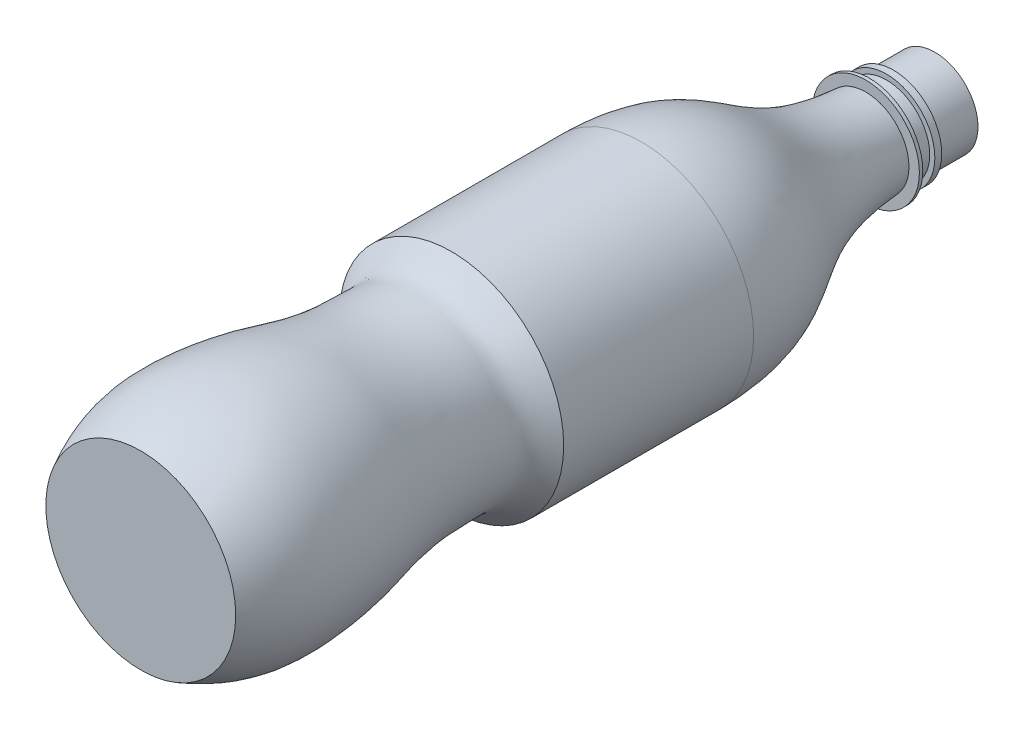
ISO-10303-21;
HEADER;
FILE_DESCRIPTION(('STEP AP214'),'2;1');
FILE_NAME('part.step','',(''),(''),'','','');
FILE_SCHEMA(('AUTOMOTIVE_DESIGN { 1 0 10303 214 1 1 1 1 }'));
ENDSEC;
DATA;
#1=APPLICATION_CONTEXT('core data for automotive mechanical design processes');
#2=APPLICATION_PROTOCOL_DEFINITION('international standard','automotive_design',2000,#1);
#3=PRODUCT_CONTEXT('',#1,'mechanical');
#4=PRODUCT('Part','Part','',(#3));
#5=PRODUCT_RELATED_PRODUCT_CATEGORY('part','',(#4));
#6=PRODUCT_DEFINITION_FORMATION('','',#4);
#7=PRODUCT_DEFINITION_CONTEXT('part definition',#1,'design');
#8=PRODUCT_DEFINITION('design','',#6,#7);
#9=PRODUCT_DEFINITION_SHAPE('','',#8);
#10=(LENGTH_UNIT() NAMED_UNIT(*) SI_UNIT(.MILLI.,.METRE.));
#11=(NAMED_UNIT(*) PLANE_ANGLE_UNIT() SI_UNIT($,.RADIAN.));
#12=(NAMED_UNIT(*) SI_UNIT($,.STERADIAN.) SOLID_ANGLE_UNIT());
#13=UNCERTAINTY_MEASURE_WITH_UNIT(LENGTH_MEASURE(1.E-05),#10,'distance_accuracy_value','');
#14=(GEOMETRIC_REPRESENTATION_CONTEXT(3) GLOBAL_UNCERTAINTY_ASSIGNED_CONTEXT((#13)) GLOBAL_UNIT_ASSIGNED_CONTEXT((#10,
#11,#12)) REPRESENTATION_CONTEXT('',''));
#15=CARTESIAN_POINT('',(0.,0.,0.));
#16=DIRECTION('',(0.,0.,1.));
#17=DIRECTION('',(1.,0.,0.));
#18=AXIS2_PLACEMENT_3D('',#15,#16,#17);
#19=CARTESIAN_POINT('',(0.,0.,-210.999877803679));
#20=DIRECTION('',(0.,0.,1.));
#21=DIRECTION('',(1.,0.,0.));
#22=AXIS2_PLACEMENT_3D('',#19,#20,#21);
#23=CONICAL_SURFACE('',#22,15.4999785685203,0.0156332216599378);
#24=CARTESIAN_POINT('',(0.,0.,-210.));
#25=DIRECTION('',(0.,0.,1.));
#26=DIRECTION('',(1.,0.,0.));
#27=AXIS2_PLACEMENT_3D('',#24,#25,#26);
#28=CIRCLE('',#27,15.5156111534009);
#29=CARTESIAN_POINT('',(15.5156111534009,0.,-210.));
#30=VERTEX_POINT('',#29);
#31=EDGE_CURVE('E10',#30,#30,#28,.T.);
#32=ORIENTED_EDGE('',*,*,#31,.F.);
#33=EDGE_LOOP('',(#32));
#34=FACE_BOUND('',#33,.T.);
#35=CARTESIAN_POINT('',(0.,0.,-210.999877803679));
#36=DIRECTION('',(0.,0.,1.));
#37=DIRECTION('',(1.,0.,0.));
#38=AXIS2_PLACEMENT_3D('',#35,#36,#37);
#39=CIRCLE('',#38,15.4999785685203);
#40=CARTESIAN_POINT('',(15.4999785685203,0.,-210.999877803679));
#41=VERTEX_POINT('',#40);
#42=EDGE_CURVE('E88',#41,#41,#39,.T.);
#43=ORIENTED_EDGE('',*,*,#42,.T.);
#44=EDGE_LOOP('',(#43));
#45=FACE_BOUND('',#44,.T.);
#46=ADVANCED_FACE('F37',(#34,#45),#23,.T.);
#47=CARTESIAN_POINT('',(15.5156111534009,0.,-210.));
#48=DIRECTION('',(0.,0.,-1.));
#49=DIRECTION('',(-1.,0.,0.));
#50=AXIS2_PLACEMENT_3D('',#47,#48,#49);
#51=PLANE('',#50);
#52=CARTESIAN_POINT('',(0.,0.,-210.));
#53=DIRECTION('',(0.,0.,1.));
#54=DIRECTION('',(1.,0.,0.));
#55=AXIS2_PLACEMENT_3D('',#52,#53,#54);
#56=CIRCLE('',#55,12.5);
#57=CARTESIAN_POINT('',(12.5,0.,-210.));
#58=VERTEX_POINT('',#57);
#59=EDGE_CURVE('E44',#58,#58,#56,.T.);
#60=ORIENTED_EDGE('',*,*,#59,.F.);
#61=EDGE_LOOP('',(#60));
#62=FACE_BOUND('',#61,.T.);
#63=ORIENTED_EDGE('',*,*,#31,.T.);
#64=EDGE_LOOP('',(#63));
#65=FACE_BOUND('',#64,.T.);
#66=ADVANCED_FACE('F116',(#62,#65),#51,.F.);
#67=CARTESIAN_POINT('',(12.5,0.,-210.));
#68=CARTESIAN_POINT('',(14.9221307706885,0.,-175.127506462056));
#69=CARTESIAN_POINT('',(31.9793387542525,0.,-179.564350305711));
#70=CARTESIAN_POINT('',(32.5,0.,-145.));
#71=B_SPLINE_CURVE_WITH_KNOTS('',3,(#67,#68,#69,#70),.UNSPECIFIED.,.F.,.F.,(4,4),(0.,1.),.UNSPECIFIED.);
#72=CARTESIAN_POINT('',(0.,0.,0.));
#73=DIRECTION('',(0.,0.,1.));
#74=AXIS1_PLACEMENT('',#72,#73);
#75=SURFACE_OF_REVOLUTION('',#71,#74);
#76=CARTESIAN_POINT('',(0.,0.,-145.));
#77=DIRECTION('',(0.,0.,1.));
#78=DIRECTION('',(1.,0.,0.));
#79=AXIS2_PLACEMENT_3D('',#76,#77,#78);
#80=CIRCLE('',#79,32.5);
#81=CARTESIAN_POINT('',(32.5,0.,-145.));
#82=VERTEX_POINT('',#81);
#83=EDGE_CURVE('E49',#82,#82,#80,.T.);
#84=ORIENTED_EDGE('',*,*,#83,.F.);
#85=EDGE_LOOP('',(#84));
#86=FACE_BOUND('',#85,.T.);
#87=ORIENTED_EDGE('',*,*,#59,.T.);
#88=EDGE_LOOP('',(#87));
#89=FACE_BOUND('',#88,.T.);
#90=ADVANCED_FACE('F113',(#86,#89),#75,.T.);
#91=CARTESIAN_POINT('',(0.,0.,0.));
#92=DIRECTION('',(0.,0.,1.));
#93=DIRECTION('',(1.,0.,0.));
#94=AXIS2_PLACEMENT_3D('',#91,#92,#93);
#95=CYLINDRICAL_SURFACE('',#94,32.5);
#96=CARTESIAN_POINT('',(0.,0.,-90.));
#97=DIRECTION('',(0.,0.,1.));
#98=DIRECTION('',(1.,0.,0.));
#99=AXIS2_PLACEMENT_3D('',#96,#97,#98);
#100=CIRCLE('',#99,32.5);
#101=CARTESIAN_POINT('',(32.5,0.,-90.));
#102=VERTEX_POINT('',#101);
#103=EDGE_CURVE('E54',#102,#102,#100,.T.);
#104=ORIENTED_EDGE('',*,*,#103,.F.);
#105=EDGE_LOOP('',(#104));
#106=FACE_BOUND('',#105,.T.);
#107=ORIENTED_EDGE('',*,*,#83,.T.);
#108=EDGE_LOOP('',(#107));
#109=FACE_BOUND('',#108,.T.);
#110=ADVANCED_FACE('F108',(#106,#109),#95,.T.);
#111=CARTESIAN_POINT('',(32.5,0.,-90.));
#112=CARTESIAN_POINT('',(25.7218091685001,0.,-83.3161920420844));
#113=CARTESIAN_POINT('',(26.9365132757713,0.,-82.4142331079265));
#114=CARTESIAN_POINT('',(26.8100484812812,0.,-66.9977330889817));
#115=CARTESIAN_POINT('',(28.4681714802586,0.,-57.1312147134098));
#116=CARTESIAN_POINT('',(32.0962866380554,0.,-44.0107720208677));
#117=CARTESIAN_POINT('',(34.9879316806797,0.,-23.7762223622106));
#118=CARTESIAN_POINT('',(33.2149292981428,0.,-10.7399010002755));
#119=CARTESIAN_POINT('',(27.5,0.,0.));
#120=B_SPLINE_CURVE_WITH_KNOTS('',3,(#111,#112,#113,#114,#115,#116,#117,#118,#119),
.UNSPECIFIED.,.F.,.F.,(4,1,1,1,1,1,4),(0.,0.249131323415911,0.30000580236583,0.485551568706598,
0.527189357078756,0.693190465294813,1.),.UNSPECIFIED.);
#121=CARTESIAN_POINT('',(0.,0.,0.));
#122=DIRECTION('',(0.,0.,1.));
#123=AXIS1_PLACEMENT('',#121,#122);
#124=SURFACE_OF_REVOLUTION('',#120,#123);
#125=CARTESIAN_POINT('',(0.,0.,0.));
#126=DIRECTION('',(0.,0.,1.));
#127=DIRECTION('',(1.,0.,0.));
#128=AXIS2_PLACEMENT_3D('',#125,#126,#127);
#129=CIRCLE('',#128,27.5);
#130=CARTESIAN_POINT('',(27.5,0.,0.));
#131=VERTEX_POINT('',#130);
#132=EDGE_CURVE('E60',#131,#131,#129,.T.);
#133=ORIENTED_EDGE('',*,*,#132,.F.);
#134=EDGE_LOOP('',(#133));
#135=FACE_BOUND('',#134,.T.);
#136=ORIENTED_EDGE('',*,*,#103,.T.);
#137=EDGE_LOOP('',(#136));
#138=FACE_BOUND('',#137,.T.);
#139=ADVANCED_FACE('F103',(#135,#138),#124,.T.);
#140=CARTESIAN_POINT('',(27.5,0.,0.));
#141=DIRECTION('',(0.,0.,-1.));
#142=DIRECTION('',(-1.,0.,0.));
#143=AXIS2_PLACEMENT_3D('',#140,#141,#142);
#144=PLANE('',#143);
#145=ORIENTED_EDGE('',*,*,#132,.T.);
#146=EDGE_LOOP('',(#145));
#147=FACE_BOUND('',#146,.T.);
#148=ADVANCED_FACE('F107',(#147),#144,.F.);
#149=CARTESIAN_POINT('',(0.,0.,-230.));
#150=DIRECTION('',(0.,0.,1.));
#151=DIRECTION('',(1.,0.,0.));
#152=AXIS2_PLACEMENT_3D('',#149,#150,#151);
#153=PLANE('',#152);
#154=CARTESIAN_POINT('',(0.,0.,-230.));
#155=DIRECTION('',(0.,0.,1.));
#156=DIRECTION('',(1.,0.,0.));
#157=AXIS2_PLACEMENT_3D('',#154,#155,#156);
#158=CIRCLE('',#157,12.5);
#159=CARTESIAN_POINT('',(12.5,0.,-230.));
#160=VERTEX_POINT('',#159);
#161=EDGE_CURVE('E64',#160,#160,#158,.T.);
#162=ORIENTED_EDGE('',*,*,#161,.F.);
#163=EDGE_LOOP('',(#162));
#164=FACE_BOUND('',#163,.T.);
#165=ADVANCED_FACE('F162',(#164),#153,.F.);
#166=CARTESIAN_POINT('',(0.,0.,0.));
#167=DIRECTION('',(0.,0.,1.));
#168=DIRECTION('',(1.,0.,0.));
#169=AXIS2_PLACEMENT_3D('',#166,#167,#168);
#170=CYLINDRICAL_SURFACE('',#169,12.5);
#171=CARTESIAN_POINT('',(0.,0.,-218.));
#172=DIRECTION('',(0.,0.,1.));
#173=DIRECTION('',(1.,0.,0.));
#174=AXIS2_PLACEMENT_3D('',#171,#172,#173);
#175=CIRCLE('',#174,12.5);
#176=CARTESIAN_POINT('',(12.5,0.,-218.));
#177=VERTEX_POINT('',#176);
#178=EDGE_CURVE('E68',#177,#177,#175,.T.);
#179=ORIENTED_EDGE('',*,*,#178,.F.);
#180=EDGE_LOOP('',(#179));
#181=FACE_BOUND('',#180,.T.);
#182=ORIENTED_EDGE('',*,*,#161,.T.);
#183=EDGE_LOOP('',(#182));
#184=FACE_BOUND('',#183,.T.);
#185=ADVANCED_FACE('F156',(#181,#184),#170,.T.);
#186=CARTESIAN_POINT('',(12.5,0.,-217.999999999346));
#187=DIRECTION('',(0.,0.,1.));
#188=DIRECTION('',(1.,0.,0.));
#189=AXIS2_PLACEMENT_3D('',#186,#187,#188);
#190=PLANE('',#189);
#191=CARTESIAN_POINT('',(0.,0.,-217.999999998692));
#192=DIRECTION('',(0.,0.,1.));
#193=DIRECTION('',(1.,0.,0.));
#194=AXIS2_PLACEMENT_3D('',#191,#192,#193);
#195=CIRCLE('',#194,14.);
#196=CARTESIAN_POINT('',(14.,0.,-217.999999998692));
#197=VERTEX_POINT('',#196);
#198=EDGE_CURVE('E72',#197,#197,#195,.T.);
#199=ORIENTED_EDGE('',*,*,#198,.F.);
#200=EDGE_LOOP('',(#199));
#201=FACE_BOUND('',#200,.T.);
#202=ORIENTED_EDGE('',*,*,#178,.T.);
#203=EDGE_LOOP('',(#202));
#204=FACE_BOUND('',#203,.T.);
#205=ADVANCED_FACE('F150',(#201,#204),#190,.F.);
#206=CARTESIAN_POINT('',(0.,0.,-217.999999998692));
#207=DIRECTION('',(0.,0.,-1.));
#208=DIRECTION('',(-1.,0.,0.));
#209=AXIS2_PLACEMENT_3D('',#206,#207,#208);
#210=CONICAL_SURFACE('',#209,14.,3.61668160776565E-05);
#211=CARTESIAN_POINT('',(0.,0.,-216.));
#212=DIRECTION('',(0.,0.,1.));
#213=DIRECTION('',(1.,0.,0.));
#214=AXIS2_PLACEMENT_3D('',#211,#212,#213);
#215=CIRCLE('',#214,13.9999276663679);
#216=CARTESIAN_POINT('',(13.9999276663679,0.,-216.));
#217=VERTEX_POINT('',#216);
#218=EDGE_CURVE('E76',#217,#217,#215,.T.);
#219=ORIENTED_EDGE('',*,*,#218,.F.);
#220=EDGE_LOOP('',(#219));
#221=FACE_BOUND('',#220,.T.);
#222=ORIENTED_EDGE('',*,*,#198,.T.);
#223=EDGE_LOOP('',(#222));
#224=FACE_BOUND('',#223,.T.);
#225=ADVANCED_FACE('F144',(#221,#224),#210,.T.);
#226=CARTESIAN_POINT('',(13.9999276663679,0.,-216.));
#227=DIRECTION('',(0.,0.,-1.));
#228=DIRECTION('',(-1.,0.,0.));
#229=AXIS2_PLACEMENT_3D('',#226,#227,#228);
#230=PLANE('',#229);
#231=CARTESIAN_POINT('',(0.,0.,-216.));
#232=DIRECTION('',(0.,0.,1.));
#233=DIRECTION('',(1.,0.,0.));
#234=AXIS2_PLACEMENT_3D('',#231,#232,#233);
#235=CIRCLE('',#234,12.5156111534009);
#236=CARTESIAN_POINT('',(12.5156111534009,0.,-216.));
#237=VERTEX_POINT('',#236);
#238=EDGE_CURVE('E80',#237,#237,#235,.T.);
#239=ORIENTED_EDGE('',*,*,#238,.F.);
#240=EDGE_LOOP('',(#239));
#241=FACE_BOUND('',#240,.T.);
#242=ORIENTED_EDGE('',*,*,#218,.T.);
#243=EDGE_LOOP('',(#242));
#244=FACE_BOUND('',#243,.T.);
#245=ADVANCED_FACE('F138',(#241,#244),#230,.F.);
#246=CARTESIAN_POINT('',(0.,0.,-216.));
#247=DIRECTION('',(0.,0.,-1.));
#248=DIRECTION('',(-1.,0.,0.));
#249=AXIS2_PLACEMENT_3D('',#246,#247,#248);
#250=CONICAL_SURFACE('',#249,12.5156111534009,0.00311507964745954);
#251=CARTESIAN_POINT('',(0.,0.,-210.988538120296));
#252=DIRECTION('',(0.,0.,1.));
#253=DIRECTION('',(1.,0.,0.));
#254=AXIS2_PLACEMENT_3D('',#251,#252,#253);
#255=CIRCLE('',#254,12.5);
#256=CARTESIAN_POINT('',(12.5,0.,-210.988538120296));
#257=VERTEX_POINT('',#256);
#258=EDGE_CURVE('E84',#257,#257,#255,.T.);
#259=ORIENTED_EDGE('',*,*,#258,.F.);
#260=EDGE_LOOP('',(#259));
#261=FACE_BOUND('',#260,.T.);
#262=ORIENTED_EDGE('',*,*,#238,.T.);
#263=EDGE_LOOP('',(#262));
#264=FACE_BOUND('',#263,.T.);
#265=ADVANCED_FACE('F132',(#261,#264),#250,.T.);
#266=CARTESIAN_POINT('',(0.,0.,-210.988538120296));
#267=DIRECTION('',(0.,0.,-1.));
#268=DIRECTION('',(-1.,0.,0.));
#269=AXIS2_PLACEMENT_3D('',#266,#267,#268);
#270=CONICAL_SURFACE('',#269,12.5,1.56701642333308);
#271=ORIENTED_EDGE('',*,*,#42,.F.);
#272=EDGE_LOOP('',(#271));
#273=FACE_BOUND('',#272,.T.);
#274=ORIENTED_EDGE('',*,*,#258,.T.);
#275=EDGE_LOOP('',(#274));
#276=FACE_BOUND('',#275,.T.);
#277=ADVANCED_FACE('F129',(#273,#276),#270,.F.);
#278=CLOSED_SHELL('',(#46,#66,#90,#110,#139,#148,#165,#185,#205,#225,#245,#265,#277));
#279=MANIFOLD_SOLID_BREP('B2',#278);
#280=ADVANCED_BREP_SHAPE_REPRESENTATION('',(#18,#279),#14);
#281=SHAPE_DEFINITION_REPRESENTATION(#9,#280);
ENDSEC;
END-ISO-10303-21;
